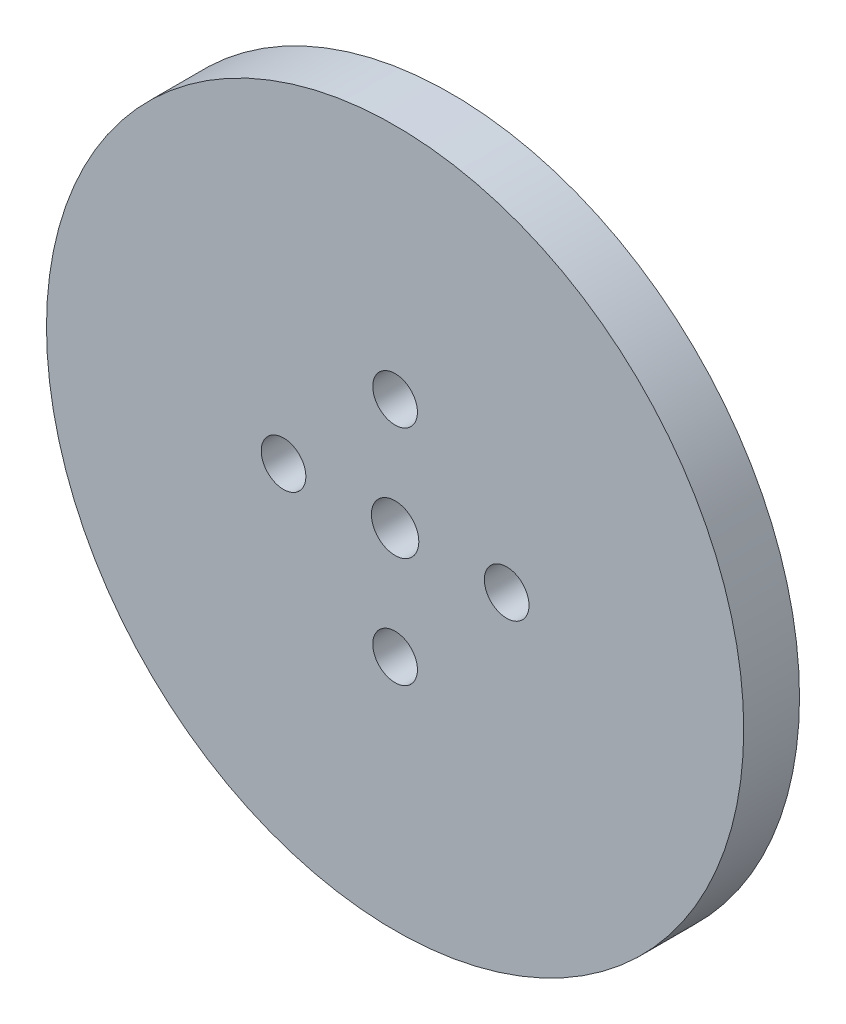
ISO-10303-21;
HEADER;
FILE_DESCRIPTION(('STEP AP214'),'2;1');
FILE_NAME('part.step','',(''),(''),'','','');
FILE_SCHEMA(('AUTOMOTIVE_DESIGN { 1 0 10303 214 1 1 1 1 }'));
ENDSEC;
DATA;
#1=APPLICATION_CONTEXT('core data for automotive mechanical design processes');
#2=APPLICATION_PROTOCOL_DEFINITION('international standard','automotive_design',2000,#1);
#3=PRODUCT_CONTEXT('',#1,'mechanical');
#4=PRODUCT('Part','Part','',(#3));
#5=PRODUCT_RELATED_PRODUCT_CATEGORY('part','',(#4));
#6=PRODUCT_DEFINITION_FORMATION('','',#4);
#7=PRODUCT_DEFINITION_CONTEXT('part definition',#1,'design');
#8=PRODUCT_DEFINITION('design','',#6,#7);
#9=PRODUCT_DEFINITION_SHAPE('','',#8);
#10=(LENGTH_UNIT() NAMED_UNIT(*) SI_UNIT(.MILLI.,.METRE.));
#11=(NAMED_UNIT(*) PLANE_ANGLE_UNIT() SI_UNIT($,.RADIAN.));
#12=(NAMED_UNIT(*) SI_UNIT($,.STERADIAN.) SOLID_ANGLE_UNIT());
#13=UNCERTAINTY_MEASURE_WITH_UNIT(LENGTH_MEASURE(1.E-05),#10,'distance_accuracy_value','');
#14=(GEOMETRIC_REPRESENTATION_CONTEXT(3) GLOBAL_UNCERTAINTY_ASSIGNED_CONTEXT((#13)) GLOBAL_UNIT_ASSIGNED_CONTEXT((#10,
#11,#12)) REPRESENTATION_CONTEXT('',''));
#15=CARTESIAN_POINT('',(0.,0.,0.));
#16=DIRECTION('',(0.,0.,1.));
#17=DIRECTION('',(1.,0.,0.));
#18=AXIS2_PLACEMENT_3D('',#15,#16,#17);
#19=CARTESIAN_POINT('',(0.,0.,6.35));
#20=DIRECTION('',(0.,0.,1.));
#21=DIRECTION('',(1.,0.,0.));
#22=AXIS2_PLACEMENT_3D('',#19,#20,#21);
#23=PLANE('',#22);
#24=CARTESIAN_POINT('',(0.,0.,6.35));
#25=DIRECTION('',(0.,0.,1.));
#26=DIRECTION('',(-1.,0.,0.));
#27=AXIS2_PLACEMENT_3D('',#24,#25,#26);
#28=CIRCLE('',#27,39.6875);
#29=CARTESIAN_POINT('',(39.6875,0.,6.35));
#30=VERTEX_POINT('',#29);
#31=EDGE_CURVE('E26',#30,#30,#28,.T.);
#32=ORIENTED_EDGE('',*,*,#31,.T.);
#33=EDGE_LOOP('',(#32));
#34=FACE_BOUND('',#33,.T.);
#35=CARTESIAN_POINT('',(0.,12.7,6.35));
#36=DIRECTION('',(0.,0.,-1.));
#37=DIRECTION('',(-1.,0.,0.));
#38=AXIS2_PLACEMENT_3D('',#35,#36,#37);
#39=CIRCLE('',#38,2.54);
#40=CARTESIAN_POINT('',(2.54,12.7,6.35));
#41=VERTEX_POINT('',#40);
#42=EDGE_CURVE('E74',#41,#41,#39,.T.);
#43=ORIENTED_EDGE('',*,*,#42,.T.);
#44=EDGE_LOOP('',(#43));
#45=FACE_BOUND('',#44,.T.);
#46=CARTESIAN_POINT('',(-12.7,0.,6.35));
#47=DIRECTION('',(0.,0.,-1.));
#48=DIRECTION('',(-1.,0.,0.));
#49=AXIS2_PLACEMENT_3D('',#46,#47,#48);
#50=CIRCLE('',#49,2.54);
#51=CARTESIAN_POINT('',(-10.16,0.,6.35));
#52=VERTEX_POINT('',#51);
#53=EDGE_CURVE('E19',#52,#52,#50,.T.);
#54=ORIENTED_EDGE('',*,*,#53,.T.);
#55=EDGE_LOOP('',(#54));
#56=FACE_BOUND('',#55,.T.);
#57=CARTESIAN_POINT('',(0.,-12.7,6.35));
#58=DIRECTION('',(0.,0.,-1.));
#59=DIRECTION('',(-1.,0.,0.));
#60=AXIS2_PLACEMENT_3D('',#57,#58,#59);
#61=CIRCLE('',#60,2.54);
#62=CARTESIAN_POINT('',(2.54,-12.7,6.35));
#63=VERTEX_POINT('',#62);
#64=EDGE_CURVE('E63',#63,#63,#61,.T.);
#65=ORIENTED_EDGE('',*,*,#64,.T.);
#66=EDGE_LOOP('',(#65));
#67=FACE_BOUND('',#66,.T.);
#68=CARTESIAN_POINT('',(12.7,0.,6.35));
#69=DIRECTION('',(0.,0.,-1.));
#70=DIRECTION('',(-1.,0.,0.));
#71=AXIS2_PLACEMENT_3D('',#68,#69,#70);
#72=CIRCLE('',#71,2.54);
#73=CARTESIAN_POINT('',(15.24,0.,6.35));
#74=VERTEX_POINT('',#73);
#75=EDGE_CURVE('E64',#74,#74,#72,.T.);
#76=ORIENTED_EDGE('',*,*,#75,.T.);
#77=EDGE_LOOP('',(#76));
#78=FACE_BOUND('',#77,.T.);
#79=CARTESIAN_POINT('',(0.,0.,6.35));
#80=DIRECTION('',(0.,0.,-1.));
#81=DIRECTION('',(-1.,0.,0.));
#82=AXIS2_PLACEMENT_3D('',#79,#80,#81);
#83=CIRCLE('',#82,2.69875);
#84=CARTESIAN_POINT('',(2.69875,0.,6.35));
#85=VERTEX_POINT('',#84);
#86=EDGE_CURVE('E106',#85,#85,#83,.T.);
#87=ORIENTED_EDGE('',*,*,#86,.T.);
#88=EDGE_LOOP('',(#87));
#89=FACE_BOUND('',#88,.T.);
#90=ADVANCED_FACE('F15',(#34,#45,#56,#67,#78,#89),#23,.T.);
#91=CARTESIAN_POINT('',(0.,0.,0.));
#92=DIRECTION('',(0.,0.,1.));
#93=DIRECTION('',(1.,0.,0.));
#94=AXIS2_PLACEMENT_3D('',#91,#92,#93);
#95=PLANE('',#94);
#96=CARTESIAN_POINT('',(0.,0.,0.));
#97=DIRECTION('',(0.,0.,-1.));
#98=DIRECTION('',(-1.,0.,0.));
#99=AXIS2_PLACEMENT_3D('',#96,#97,#98);
#100=CIRCLE('',#99,39.6875);
#101=CARTESIAN_POINT('',(39.6875,0.,0.));
#102=VERTEX_POINT('',#101);
#103=EDGE_CURVE('E10',#102,#102,#100,.T.);
#104=ORIENTED_EDGE('',*,*,#103,.T.);
#105=EDGE_LOOP('',(#104));
#106=FACE_BOUND('',#105,.T.);
#107=CARTESIAN_POINT('',(0.,12.7,0.));
#108=DIRECTION('',(0.,0.,1.));
#109=DIRECTION('',(-1.,0.,0.));
#110=AXIS2_PLACEMENT_3D('',#107,#108,#109);
#111=CIRCLE('',#110,2.54);
#112=CARTESIAN_POINT('',(2.54,12.7,0.));
#113=VERTEX_POINT('',#112);
#114=EDGE_CURVE('E72',#113,#113,#111,.T.);
#115=ORIENTED_EDGE('',*,*,#114,.T.);
#116=EDGE_LOOP('',(#115));
#117=FACE_BOUND('',#116,.T.);
#118=CARTESIAN_POINT('',(-12.7,0.,0.));
#119=DIRECTION('',(0.,0.,1.));
#120=DIRECTION('',(-1.,0.,0.));
#121=AXIS2_PLACEMENT_3D('',#118,#119,#120);
#122=CIRCLE('',#121,2.54);
#123=CARTESIAN_POINT('',(-10.16,0.,0.));
#124=VERTEX_POINT('',#123);
#125=EDGE_CURVE('E76',#124,#124,#122,.T.);
#126=ORIENTED_EDGE('',*,*,#125,.T.);
#127=EDGE_LOOP('',(#126));
#128=FACE_BOUND('',#127,.T.);
#129=CARTESIAN_POINT('',(0.,-12.7,0.));
#130=DIRECTION('',(0.,0.,1.));
#131=DIRECTION('',(-1.,0.,0.));
#132=AXIS2_PLACEMENT_3D('',#129,#130,#131);
#133=CIRCLE('',#132,2.54);
#134=CARTESIAN_POINT('',(2.54,-12.7,0.));
#135=VERTEX_POINT('',#134);
#136=EDGE_CURVE('E66',#135,#135,#133,.T.);
#137=ORIENTED_EDGE('',*,*,#136,.T.);
#138=EDGE_LOOP('',(#137));
#139=FACE_BOUND('',#138,.T.);
#140=CARTESIAN_POINT('',(12.7,0.,0.));
#141=DIRECTION('',(0.,0.,1.));
#142=DIRECTION('',(-1.,0.,0.));
#143=AXIS2_PLACEMENT_3D('',#140,#141,#142);
#144=CIRCLE('',#143,2.54);
#145=CARTESIAN_POINT('',(15.24,0.,0.));
#146=VERTEX_POINT('',#145);
#147=EDGE_CURVE('E60',#146,#146,#144,.T.);
#148=ORIENTED_EDGE('',*,*,#147,.T.);
#149=EDGE_LOOP('',(#148));
#150=FACE_BOUND('',#149,.T.);
#151=CARTESIAN_POINT('',(0.,0.,0.));
#152=DIRECTION('',(0.,0.,1.));
#153=DIRECTION('',(-1.,0.,0.));
#154=AXIS2_PLACEMENT_3D('',#151,#152,#153);
#155=CIRCLE('',#154,2.69875);
#156=CARTESIAN_POINT('',(2.69875,0.,0.));
#157=VERTEX_POINT('',#156);
#158=EDGE_CURVE('E68',#157,#157,#155,.T.);
#159=ORIENTED_EDGE('',*,*,#158,.T.);
#160=EDGE_LOOP('',(#159));
#161=FACE_BOUND('',#160,.T.);
#162=ADVANCED_FACE('F17',(#106,#117,#128,#139,#150,#161),#95,.F.);
#163=CARTESIAN_POINT('',(0.,0.,0.));
#164=DIRECTION('',(0.,0.,-1.));
#165=DIRECTION('',(-1.,0.,0.));
#166=AXIS2_PLACEMENT_3D('',#163,#164,#165);
#167=CYLINDRICAL_SURFACE('',#166,39.6875);
#168=ORIENTED_EDGE('',*,*,#103,.F.);
#169=EDGE_LOOP('',(#168));
#170=FACE_BOUND('',#169,.T.);
#171=ORIENTED_EDGE('',*,*,#31,.F.);
#172=EDGE_LOOP('',(#171));
#173=FACE_BOUND('',#172,.T.);
#174=ADVANCED_FACE('F91',(#170,#173),#167,.T.);
#175=CARTESIAN_POINT('',(0.,12.7,0.));
#176=DIRECTION('',(0.,0.,-1.));
#177=DIRECTION('',(-1.,0.,0.));
#178=AXIS2_PLACEMENT_3D('',#175,#176,#177);
#179=CYLINDRICAL_SURFACE('',#178,2.54);
#180=ORIENTED_EDGE('',*,*,#114,.F.);
#181=EDGE_LOOP('',(#180));
#182=FACE_BOUND('',#181,.T.);
#183=ORIENTED_EDGE('',*,*,#42,.F.);
#184=EDGE_LOOP('',(#183));
#185=FACE_BOUND('',#184,.T.);
#186=ADVANCED_FACE('F87',(#182,#185),#179,.F.);
#187=CARTESIAN_POINT('',(-12.7,0.,0.));
#188=DIRECTION('',(0.,0.,-1.));
#189=DIRECTION('',(-1.,0.,0.));
#190=AXIS2_PLACEMENT_3D('',#187,#188,#189);
#191=CYLINDRICAL_SURFACE('',#190,2.54);
#192=ORIENTED_EDGE('',*,*,#125,.F.);
#193=EDGE_LOOP('',(#192));
#194=FACE_BOUND('',#193,.T.);
#195=ORIENTED_EDGE('',*,*,#53,.F.);
#196=EDGE_LOOP('',(#195));
#197=FACE_BOUND('',#196,.T.);
#198=ADVANCED_FACE('F90',(#194,#197),#191,.F.);
#199=CARTESIAN_POINT('',(0.,-12.7,0.));
#200=DIRECTION('',(0.,0.,-1.));
#201=DIRECTION('',(-1.,0.,0.));
#202=AXIS2_PLACEMENT_3D('',#199,#200,#201);
#203=CYLINDRICAL_SURFACE('',#202,2.54);
#204=ORIENTED_EDGE('',*,*,#136,.F.);
#205=EDGE_LOOP('',(#204));
#206=FACE_BOUND('',#205,.T.);
#207=ORIENTED_EDGE('',*,*,#64,.F.);
#208=EDGE_LOOP('',(#207));
#209=FACE_BOUND('',#208,.T.);
#210=ADVANCED_FACE('F114',(#206,#209),#203,.F.);
#211=CARTESIAN_POINT('',(12.7,0.,0.));
#212=DIRECTION('',(0.,0.,-1.));
#213=DIRECTION('',(-1.,0.,0.));
#214=AXIS2_PLACEMENT_3D('',#211,#212,#213);
#215=CYLINDRICAL_SURFACE('',#214,2.54);
#216=ORIENTED_EDGE('',*,*,#147,.F.);
#217=EDGE_LOOP('',(#216));
#218=FACE_BOUND('',#217,.T.);
#219=ORIENTED_EDGE('',*,*,#75,.F.);
#220=EDGE_LOOP('',(#219));
#221=FACE_BOUND('',#220,.T.);
#222=ADVANCED_FACE('F117',(#218,#221),#215,.F.);
#223=CARTESIAN_POINT('',(0.,0.,0.));
#224=DIRECTION('',(0.,0.,-1.));
#225=DIRECTION('',(-1.,0.,0.));
#226=AXIS2_PLACEMENT_3D('',#223,#224,#225);
#227=CYLINDRICAL_SURFACE('',#226,2.69875);
#228=ORIENTED_EDGE('',*,*,#158,.F.);
#229=EDGE_LOOP('',(#228));
#230=FACE_BOUND('',#229,.T.);
#231=ORIENTED_EDGE('',*,*,#86,.F.);
#232=EDGE_LOOP('',(#231));
#233=FACE_BOUND('',#232,.T.);
#234=ADVANCED_FACE('F124',(#230,#233),#227,.F.);
#235=CLOSED_SHELL('',(#90,#162,#174,#186,#198,#210,#222,#234));
#236=MANIFOLD_SOLID_BREP('B1',#235);
#237=ADVANCED_BREP_SHAPE_REPRESENTATION('',(#18,#236),#14);
#238=SHAPE_DEFINITION_REPRESENTATION(#9,#237);
ENDSEC;
END-ISO-10303-21;
